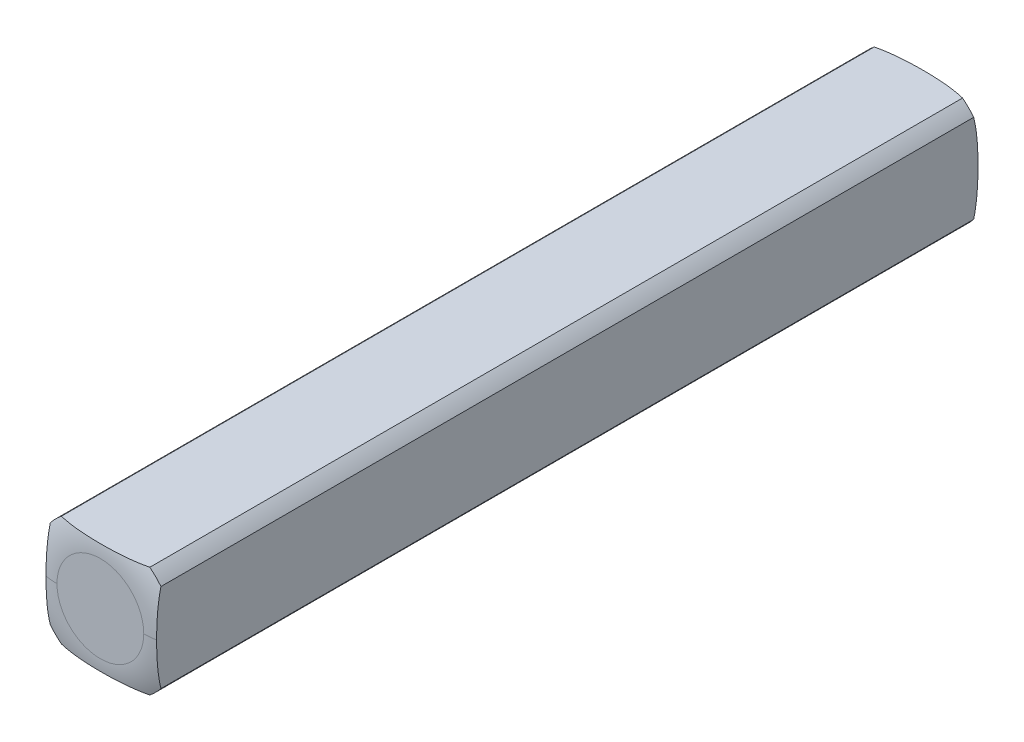
ISO-10303-21;
HEADER;
FILE_DESCRIPTION(('STEP AP214'),'2;1');
FILE_NAME('part.step','',(''),(''),'','','');
FILE_SCHEMA(('AUTOMOTIVE_DESIGN { 1 0 10303 214 1 1 1 1 }'));
ENDSEC;
DATA;
#1=APPLICATION_CONTEXT('core data for automotive mechanical design processes');
#2=APPLICATION_PROTOCOL_DEFINITION('international standard','automotive_design',2000,#1);
#3=PRODUCT_CONTEXT('',#1,'mechanical');
#4=PRODUCT('Part','Part','',(#3));
#5=PRODUCT_RELATED_PRODUCT_CATEGORY('part','',(#4));
#6=PRODUCT_DEFINITION_FORMATION('','',#4);
#7=PRODUCT_DEFINITION_CONTEXT('part definition',#1,'design');
#8=PRODUCT_DEFINITION('design','',#6,#7);
#9=PRODUCT_DEFINITION_SHAPE('','',#8);
#10=(LENGTH_UNIT() NAMED_UNIT(*) SI_UNIT(.MILLI.,.METRE.));
#11=(NAMED_UNIT(*) PLANE_ANGLE_UNIT() SI_UNIT($,.RADIAN.));
#12=(NAMED_UNIT(*) SI_UNIT($,.STERADIAN.) SOLID_ANGLE_UNIT());
#13=UNCERTAINTY_MEASURE_WITH_UNIT(LENGTH_MEASURE(1.E-05),#10,'distance_accuracy_value','');
#14=(GEOMETRIC_REPRESENTATION_CONTEXT(3) GLOBAL_UNCERTAINTY_ASSIGNED_CONTEXT((#13)) GLOBAL_UNIT_ASSIGNED_CONTEXT((#10,
#11,#12)) REPRESENTATION_CONTEXT('',''));
#15=CARTESIAN_POINT('',(0.,0.,0.));
#16=DIRECTION('',(0.,0.,1.));
#17=DIRECTION('',(1.,0.,0.));
#18=AXIS2_PLACEMENT_3D('',#15,#16,#17);
#19=CARTESIAN_POINT('',(0.,0.,-11.811));
#20=DIRECTION('',(0.,0.,1.));
#21=DIRECTION('',(1.,0.,0.));
#22=AXIS2_PLACEMENT_3D('',#19,#20,#21);
#23=CYLINDRICAL_SURFACE('',#22,2.032);
#24=CARTESIAN_POINT('',(0.,0.,-11.659919142098));
#25=DIRECTION('',(0.,0.,1.));
#26=DIRECTION('',(1.,0.,0.));
#27=AXIS2_PLACEMENT_3D('',#24,#25,#26);
#28=CIRCLE('',#27,2.032);
#29=CARTESIAN_POINT('',(-1.26841150657032,1.5875,-11.659919142098));
#30=VERTEX_POINT('',#29);
#31=CARTESIAN_POINT('',(-1.5875,1.26841150657032,-11.659919142098));
#32=VERTEX_POINT('',#31);
#33=EDGE_CURVE('E226',#30,#32,#28,.T.);
#34=ORIENTED_EDGE('',*,*,#33,.T.);
#35=DIRECTION('',(0.,0.,1.));
#36=VECTOR('',#35,1.);
#37=CARTESIAN_POINT('',(-1.5875,1.26841150657032,-11.811));
#38=LINE('',#37,#36);
#39=CARTESIAN_POINT('',(-1.5875,1.26841150657032,11.659919142098));
#40=VERTEX_POINT('',#39);
#41=EDGE_CURVE('E398',#32,#40,#38,.T.);
#42=ORIENTED_EDGE('',*,*,#41,.T.);
#43=CARTESIAN_POINT('',(0.,0.,11.659919142098));
#44=DIRECTION('',(0.,0.,-1.));
#45=DIRECTION('',(-1.,0.,0.));
#46=AXIS2_PLACEMENT_3D('',#43,#44,#45);
#47=CIRCLE('',#46,2.032);
#48=CARTESIAN_POINT('',(-1.26841150657032,1.5875,11.659919142098));
#49=VERTEX_POINT('',#48);
#50=EDGE_CURVE('E9',#40,#49,#47,.T.);
#51=ORIENTED_EDGE('',*,*,#50,.T.);
#52=DIRECTION('',(0.,0.,-1.));
#53=VECTOR('',#52,1.);
#54=CARTESIAN_POINT('',(-1.26841150657032,1.5875,-11.811));
#55=LINE('',#54,#53);
#56=EDGE_CURVE('E696',#49,#30,#55,.T.);
#57=ORIENTED_EDGE('',*,*,#56,.T.);
#58=EDGE_LOOP('',(#34,#42,#51,#57));
#59=FACE_BOUND('',#58,.T.);
#60=ADVANCED_FACE('F15',(#59),#23,.T.);
#61=CARTESIAN_POINT('',(0.,0.,-11.811));
#62=DIRECTION('',(0.,0.,1.));
#63=DIRECTION('',(1.,0.,0.));
#64=AXIS2_PLACEMENT_3D('',#61,#62,#63);
#65=CYLINDRICAL_SURFACE('',#64,2.032);
#66=CARTESIAN_POINT('',(0.,0.,-11.659919142098));
#67=DIRECTION('',(0.,0.,1.));
#68=DIRECTION('',(1.,0.,0.));
#69=AXIS2_PLACEMENT_3D('',#66,#67,#68);
#70=CIRCLE('',#69,2.032);
#71=CARTESIAN_POINT('',(1.5875,1.26841150657032,-11.659919142098));
#72=VERTEX_POINT('',#71);
#73=CARTESIAN_POINT('',(1.26841150657032,1.5875,-11.659919142098));
#74=VERTEX_POINT('',#73);
#75=EDGE_CURVE('E386',#72,#74,#70,.T.);
#76=ORIENTED_EDGE('',*,*,#75,.T.);
#77=DIRECTION('',(0.,0.,1.));
#78=VECTOR('',#77,1.);
#79=CARTESIAN_POINT('',(1.26841150657032,1.5875,-11.811));
#80=LINE('',#79,#78);
#81=CARTESIAN_POINT('',(1.26841150657032,1.5875,11.659919142098));
#82=VERTEX_POINT('',#81);
#83=EDGE_CURVE('E579',#74,#82,#80,.T.);
#84=ORIENTED_EDGE('',*,*,#83,.T.);
#85=CARTESIAN_POINT('',(0.,0.,11.659919142098));
#86=DIRECTION('',(0.,0.,-1.));
#87=DIRECTION('',(-1.,0.,0.));
#88=AXIS2_PLACEMENT_3D('',#85,#86,#87);
#89=CIRCLE('',#88,2.032);
#90=CARTESIAN_POINT('',(1.5875,1.26841150657032,11.659919142098));
#91=VERTEX_POINT('',#90);
#92=EDGE_CURVE('E30',#82,#91,#89,.T.);
#93=ORIENTED_EDGE('',*,*,#92,.T.);
#94=DIRECTION('',(0.,0.,-1.));
#95=VECTOR('',#94,1.);
#96=CARTESIAN_POINT('',(1.5875,1.26841150657032,-11.811));
#97=LINE('',#96,#95);
#98=EDGE_CURVE('E566',#91,#72,#97,.T.);
#99=ORIENTED_EDGE('',*,*,#98,.T.);
#100=EDGE_LOOP('',(#76,#84,#93,#99));
#101=FACE_BOUND('',#100,.T.);
#102=ADVANCED_FACE('F337',(#101),#65,.T.);
#103=CARTESIAN_POINT('',(0.,0.,-11.811));
#104=DIRECTION('',(0.,0.,1.));
#105=DIRECTION('',(1.,0.,0.));
#106=AXIS2_PLACEMENT_3D('',#103,#104,#105);
#107=CYLINDRICAL_SURFACE('',#106,2.032);
#108=CARTESIAN_POINT('',(0.,0.,-11.659919142098));
#109=DIRECTION('',(0.,0.,1.));
#110=DIRECTION('',(1.,0.,0.));
#111=AXIS2_PLACEMENT_3D('',#108,#109,#110);
#112=CIRCLE('',#111,2.032);
#113=CARTESIAN_POINT('',(1.26841150657032,-1.5875,-11.659919142098));
#114=VERTEX_POINT('',#113);
#115=CARTESIAN_POINT('',(1.5875,-1.26841150657032,-11.659919142098));
#116=VERTEX_POINT('',#115);
#117=EDGE_CURVE('E177',#114,#116,#112,.T.);
#118=ORIENTED_EDGE('',*,*,#117,.T.);
#119=DIRECTION('',(0.,0.,1.));
#120=VECTOR('',#119,1.);
#121=CARTESIAN_POINT('',(1.5875,-1.26841150657032,-11.811));
#122=LINE('',#121,#120);
#123=CARTESIAN_POINT('',(1.5875,-1.26841150657032,11.659919142098));
#124=VERTEX_POINT('',#123);
#125=EDGE_CURVE('E457',#116,#124,#122,.T.);
#126=ORIENTED_EDGE('',*,*,#125,.T.);
#127=CARTESIAN_POINT('',(0.,0.,11.659919142098));
#128=DIRECTION('',(0.,0.,-1.));
#129=DIRECTION('',(-1.,0.,0.));
#130=AXIS2_PLACEMENT_3D('',#127,#128,#129);
#131=CIRCLE('',#130,2.032);
#132=CARTESIAN_POINT('',(1.26841150657032,-1.5875,11.659919142098));
#133=VERTEX_POINT('',#132);
#134=EDGE_CURVE('E276',#124,#133,#131,.T.);
#135=ORIENTED_EDGE('',*,*,#134,.T.);
#136=DIRECTION('',(0.,0.,-1.));
#137=VECTOR('',#136,1.);
#138=CARTESIAN_POINT('',(1.26841150657032,-1.5875,-11.811));
#139=LINE('',#138,#137);
#140=EDGE_CURVE('E458',#133,#114,#139,.T.);
#141=ORIENTED_EDGE('',*,*,#140,.T.);
#142=EDGE_LOOP('',(#118,#126,#135,#141));
#143=FACE_BOUND('',#142,.T.);
#144=ADVANCED_FACE('F17',(#143),#107,.T.);
#145=CARTESIAN_POINT('',(0.,0.,-11.811));
#146=DIRECTION('',(0.,0.,1.));
#147=DIRECTION('',(1.,0.,0.));
#148=AXIS2_PLACEMENT_3D('',#145,#146,#147);
#149=CYLINDRICAL_SURFACE('',#148,2.032);
#150=CARTESIAN_POINT('',(0.,0.,-11.659919142098));
#151=DIRECTION('',(0.,0.,1.));
#152=DIRECTION('',(1.,0.,0.));
#153=AXIS2_PLACEMENT_3D('',#150,#151,#152);
#154=CIRCLE('',#153,2.032);
#155=CARTESIAN_POINT('',(-1.5875,-1.26841150657032,-11.659919142098));
#156=VERTEX_POINT('',#155);
#157=CARTESIAN_POINT('',(-1.26841150657032,-1.5875,-11.659919142098));
#158=VERTEX_POINT('',#157);
#159=EDGE_CURVE('E147',#156,#158,#154,.T.);
#160=ORIENTED_EDGE('',*,*,#159,.T.);
#161=DIRECTION('',(0.,0.,1.));
#162=VECTOR('',#161,1.);
#163=CARTESIAN_POINT('',(-1.26841150657032,-1.5875,-11.811));
#164=LINE('',#163,#162);
#165=CARTESIAN_POINT('',(-1.26841150657032,-1.5875,11.659919142098));
#166=VERTEX_POINT('',#165);
#167=EDGE_CURVE('E463',#158,#166,#164,.T.);
#168=ORIENTED_EDGE('',*,*,#167,.T.);
#169=CARTESIAN_POINT('',(0.,0.,11.659919142098));
#170=DIRECTION('',(0.,0.,-1.));
#171=DIRECTION('',(-1.,0.,0.));
#172=AXIS2_PLACEMENT_3D('',#169,#170,#171);
#173=CIRCLE('',#172,2.032);
#174=CARTESIAN_POINT('',(-1.5875,-1.26841150657032,11.659919142098));
#175=VERTEX_POINT('',#174);
#176=EDGE_CURVE('E506',#166,#175,#173,.T.);
#177=ORIENTED_EDGE('',*,*,#176,.T.);
#178=DIRECTION('',(0.,0.,-1.));
#179=VECTOR('',#178,1.);
#180=CARTESIAN_POINT('',(-1.5875,-1.26841150657032,-11.811));
#181=LINE('',#180,#179);
#182=EDGE_CURVE('E365',#175,#156,#181,.T.);
#183=ORIENTED_EDGE('',*,*,#182,.T.);
#184=EDGE_LOOP('',(#160,#168,#177,#183));
#185=FACE_BOUND('',#184,.T.);
#186=ADVANCED_FACE('F309',(#185),#149,.T.);
#187=CARTESIAN_POINT('',(-1.5875,1.5875,11.811));
#188=DIRECTION('',(0.,0.,-1.));
#189=DIRECTION('',(0.,-1.,0.));
#190=AXIS2_PLACEMENT_3D('',#187,#188,#189);
#191=PLANE('',#190);
#192=CARTESIAN_POINT('',(0.,0.,11.811));
#193=DIRECTION('',(0.,0.,1.));
#194=DIRECTION('',(1.,0.,0.));
#195=AXIS2_PLACEMENT_3D('',#192,#193,#194);
#196=CIRCLE('',#195,1.24506403026729);
#197=CARTESIAN_POINT('',(1.24506403026729,0.,11.811));
#198=VERTEX_POINT('',#197);
#199=CARTESIAN_POINT('',(-1.24506403026729,0.,11.811));
#200=VERTEX_POINT('',#199);
#201=EDGE_CURVE('E139',#198,#200,#196,.T.);
#202=ORIENTED_EDGE('',*,*,#201,.T.);
#203=CARTESIAN_POINT('',(0.,0.,11.811));
#204=DIRECTION('',(0.,0.,1.));
#205=DIRECTION('',(1.,0.,0.));
#206=AXIS2_PLACEMENT_3D('',#203,#204,#205);
#207=CIRCLE('',#206,1.24506403026729);
#208=EDGE_CURVE('E145',#200,#198,#207,.T.);
#209=ORIENTED_EDGE('',*,*,#208,.T.);
#210=EDGE_LOOP('',(#202,#209));
#211=FACE_BOUND('',#210,.T.);
#212=ADVANCED_FACE('F138',(#211),#191,.F.);
#213=CARTESIAN_POINT('',(-1.5875,1.5875,-11.811));
#214=DIRECTION('',(0.,0.,-1.));
#215=DIRECTION('',(0.,-1.,0.));
#216=AXIS2_PLACEMENT_3D('',#213,#214,#215);
#217=PLANE('',#216);
#218=CARTESIAN_POINT('',(0.,0.,-11.811));
#219=DIRECTION('',(0.,0.,1.));
#220=DIRECTION('',(1.,0.,0.));
#221=AXIS2_PLACEMENT_3D('',#218,#219,#220);
#222=CIRCLE('',#221,1.24506403026729);
#223=CARTESIAN_POINT('',(1.24506403026729,0.,-11.811));
#224=VERTEX_POINT('',#223);
#225=CARTESIAN_POINT('',(-1.24506403026729,0.,-11.811));
#226=VERTEX_POINT('',#225);
#227=EDGE_CURVE('E167',#224,#226,#222,.T.);
#228=ORIENTED_EDGE('',*,*,#227,.F.);
#229=CARTESIAN_POINT('',(0.,0.,-11.811));
#230=DIRECTION('',(0.,0.,1.));
#231=DIRECTION('',(1.,0.,0.));
#232=AXIS2_PLACEMENT_3D('',#229,#230,#231);
#233=CIRCLE('',#232,1.24506403026729);
#234=EDGE_CURVE('E173',#226,#224,#233,.T.);
#235=ORIENTED_EDGE('',*,*,#234,.F.);
#236=EDGE_LOOP('',(#228,#235));
#237=FACE_BOUND('',#236,.T.);
#238=ADVANCED_FACE('F613',(#237),#217,.T.);
#239=CARTESIAN_POINT('',(0.,0.,9.686));
#240=DIRECTION('',(0.,0.,-1.));
#241=DIRECTION('',(1.,0.,0.));
#242=AXIS2_PLACEMENT_3D('',#239,#240,#241);
#243=DEGENERATE_TOROIDAL_SURFACE('',#242,1.24506403026729,2.125,.T.);
#244=CARTESIAN_POINT('',(-1.24506403026729,0.,9.686));
#245=DIRECTION('',(0.,-1.,0.));
#246=DIRECTION('',(1.,0.,0.));
#247=AXIS2_PLACEMENT_3D('',#244,#245,#246);
#248=CIRCLE('',#247,2.125);
#249=CARTESIAN_POINT('',(-1.5875,0.,11.7832273616929));
#250=VERTEX_POINT('',#249);
#251=EDGE_CURVE('E146',#200,#250,#248,.T.);
#252=ORIENTED_EDGE('',*,*,#251,.F.);
#253=ORIENTED_EDGE('',*,*,#201,.F.);
#254=CARTESIAN_POINT('',(1.24506403026729,0.,9.686));
#255=DIRECTION('',(0.,1.,0.));
#256=DIRECTION('',(0.,0.,1.));
#257=AXIS2_PLACEMENT_3D('',#254,#255,#256);
#258=CIRCLE('',#257,2.125);
#259=CARTESIAN_POINT('',(1.5875,0.,11.7832273616929));
#260=VERTEX_POINT('',#259);
#261=EDGE_CURVE('E165',#198,#260,#258,.T.);
#262=ORIENTED_EDGE('',*,*,#261,.T.);
#263=CARTESIAN_POINT('',(1.5875,1.26841150657033,11.659919142098));
#264=CARTESIAN_POINT('',(1.5875,0.98707709494531,11.7299306391268));
#265=CARTESIAN_POINT('',(1.5875,0.63953045901757,11.7591819538896));
#266=CARTESIAN_POINT('',(1.5875,0.35383729755582,11.7832273616929));
#267=CARTESIAN_POINT('',(1.5875,0.,11.7832273616929));
#268=B_SPLINE_CURVE_WITH_KNOTS('',2,(#263,#264,#265,#266,#267),.UNSPECIFIED.,.F.,.F.,(3,2,3),
(0.,0.5,1.),.UNSPECIFIED.);
#269=EDGE_CURVE('E575',#91,#260,#268,.T.);
#270=ORIENTED_EDGE('',*,*,#269,.F.);
#271=ORIENTED_EDGE('',*,*,#92,.F.);
#272=CARTESIAN_POINT('',(-1.26841150657032,1.5875,11.659919142098));
#273=CARTESIAN_POINT('',(-0.770338232190248,1.5875,11.7838672057847));
#274=CARTESIAN_POINT('',(0.00849337593368006,1.5875,11.7832236517902));
#275=CARTESIAN_POINT('',(0.775470990418345,1.5875,11.7825898928334));
#276=CARTESIAN_POINT('',(1.26841150657033,1.5875,11.659919142098));
#277=B_SPLINE_CURVE_WITH_KNOTS('',2,(#272,#273,#274,#275,#276),.UNSPECIFIED.,.F.,.F.,(3,2,3),
(0.,0.5,1.),.UNSPECIFIED.);
#278=EDGE_CURVE('E180',#49,#82,#277,.T.);
#279=ORIENTED_EDGE('',*,*,#278,.F.);
#280=ORIENTED_EDGE('',*,*,#50,.F.);
#281=CARTESIAN_POINT('',(-1.5875,0.,11.7832273616929));
#282=CARTESIAN_POINT('',(-1.5875,0.353179957375675,11.7832273616929));
#283=CARTESIAN_POINT('',(-1.5875,0.6395293222865,11.7591820494506));
#284=CARTESIAN_POINT('',(-1.5875,0.986669843228865,11.7300319857842));
#285=CARTESIAN_POINT('',(-1.5875,1.26841150657033,11.659919142098));
#286=B_SPLINE_CURVE_WITH_KNOTS('',2,(#281,#282,#283,#284,#285),.UNSPECIFIED.,.F.,.F.,(3,2,3),
(0.,0.5,1.),.UNSPECIFIED.);
#287=EDGE_CURVE('E152',#250,#40,#286,.T.);
#288=ORIENTED_EDGE('',*,*,#287,.F.);
#289=EDGE_LOOP('',(#252,#253,#262,#270,#271,#279,#280,#288));
#290=FACE_BOUND('',#289,.T.);
#291=ADVANCED_FACE('F148',(#290),#243,.T.);
#292=CARTESIAN_POINT('',(0.,0.,-9.686));
#293=DIRECTION('',(0.,0.,1.));
#294=DIRECTION('',(1.,0.,0.));
#295=AXIS2_PLACEMENT_3D('',#292,#293,#294);
#296=DEGENERATE_TOROIDAL_SURFACE('',#295,1.24506403026729,2.125,.T.);
#297=CARTESIAN_POINT('',(-1.24506403026729,0.,-9.686));
#298=DIRECTION('',(0.,1.,0.));
#299=DIRECTION('',(-1.,0.,0.));
#300=AXIS2_PLACEMENT_3D('',#297,#298,#299);
#301=CIRCLE('',#300,2.125);
#302=CARTESIAN_POINT('',(-1.5875,0.,-11.7832273616929));
#303=VERTEX_POINT('',#302);
#304=EDGE_CURVE('E172',#226,#303,#301,.T.);
#305=ORIENTED_EDGE('',*,*,#304,.F.);
#306=ORIENTED_EDGE('',*,*,#234,.T.);
#307=CARTESIAN_POINT('',(1.24506403026729,0.,-9.686));
#308=DIRECTION('',(0.,-1.,0.));
#309=DIRECTION('',(0.,0.,-1.));
#310=AXIS2_PLACEMENT_3D('',#307,#308,#309);
#311=CIRCLE('',#310,2.125);
#312=CARTESIAN_POINT('',(1.5875,0.,-11.7832273616929));
#313=VERTEX_POINT('',#312);
#314=EDGE_CURVE('E387',#224,#313,#311,.T.);
#315=ORIENTED_EDGE('',*,*,#314,.T.);
#316=CARTESIAN_POINT('',(1.5875,-1.26841150657032,-11.659919142098));
#317=CARTESIAN_POINT('',(1.5875,-0.987077094941897,-11.7299306391276));
#318=CARTESIAN_POINT('',(1.5875,-0.63953045901757,-11.7591819538896));
#319=CARTESIAN_POINT('',(1.5875,-0.35383729755031,-11.7832273616928));
#320=CARTESIAN_POINT('',(1.5875,0.,-11.7832273616928));
#321=B_SPLINE_CURVE_WITH_KNOTS('',2,(#316,#317,#318,#319,#320),.UNSPECIFIED.,.F.,.F.,(3,2,3),
(0.,0.5,1.),.UNSPECIFIED.);
#322=EDGE_CURVE('E562',#116,#313,#321,.T.);
#323=ORIENTED_EDGE('',*,*,#322,.F.);
#324=ORIENTED_EDGE('',*,*,#117,.F.);
#325=CARTESIAN_POINT('',(-1.26841150657032,-1.5875,-11.659919142098));
#326=CARTESIAN_POINT('',(-0.770338232190255,-1.5875,-11.7838672057848));
#327=CARTESIAN_POINT('',(0.00849337593367507,-1.5875,-11.7832236517902));
#328=CARTESIAN_POINT('',(0.77547099041835,-1.5875,-11.7825898928334));
#329=CARTESIAN_POINT('',(1.26841150657033,-1.5875,-11.659919142098));
#330=B_SPLINE_CURVE_WITH_KNOTS('',2,(#325,#326,#327,#328,#329),.UNSPECIFIED.,.F.,.F.,(3,2,3),
(0.,0.5,1.),.UNSPECIFIED.);
#331=EDGE_CURVE('E324',#158,#114,#330,.T.);
#332=ORIENTED_EDGE('',*,*,#331,.F.);
#333=ORIENTED_EDGE('',*,*,#159,.F.);
#334=CARTESIAN_POINT('',(-1.5875,0.,-11.7832273616928));
#335=CARTESIAN_POINT('',(-1.5875,-0.35317995737031,-11.7832273616928));
#336=CARTESIAN_POINT('',(-1.5875,-0.639529322286498,-11.7591820494506));
#337=CARTESIAN_POINT('',(-1.5875,-0.986669843225563,-11.730031985785));
#338=CARTESIAN_POINT('',(-1.5875,-1.26841150657032,-11.659919142098));
#339=B_SPLINE_CURVE_WITH_KNOTS('',2,(#334,#335,#336,#337,#338),.UNSPECIFIED.,.F.,.F.,(3,2,3),
(0.,0.5,1.),.UNSPECIFIED.);
#340=EDGE_CURVE('E366',#303,#156,#339,.T.);
#341=ORIENTED_EDGE('',*,*,#340,.F.);
#342=EDGE_LOOP('',(#305,#306,#315,#323,#324,#332,#333,#341));
#343=FACE_BOUND('',#342,.T.);
#344=ADVANCED_FACE('F196',(#343),#296,.T.);
#345=CARTESIAN_POINT('',(-1.5875,1.5875,11.811));
#346=DIRECTION('',(0.,-1.,0.));
#347=DIRECTION('',(0.,0.,-1.));
#348=AXIS2_PLACEMENT_3D('',#345,#346,#347);
#349=PLANE('',#348);
#350=ORIENTED_EDGE('',*,*,#83,.F.);
#351=CARTESIAN_POINT('',(1.26841150657033,1.5875,-11.659919142098));
#352=CARTESIAN_POINT('',(0.770338232190255,1.5875,-11.7838672057848));
#353=CARTESIAN_POINT('',(-0.00849337593367486,1.5875,-11.7832236517902));
#354=CARTESIAN_POINT('',(-0.775470990418348,1.5875,-11.7825898928334));
#355=CARTESIAN_POINT('',(-1.26841150657032,1.5875,-11.659919142098));
#356=B_SPLINE_CURVE_WITH_KNOTS('',2,(#351,#352,#353,#354,#355),.UNSPECIFIED.,.F.,.F.,(3,2,3),
(0.,0.5,1.),.UNSPECIFIED.);
#357=EDGE_CURVE('E221',#74,#30,#356,.T.);
#358=ORIENTED_EDGE('',*,*,#357,.T.);
#359=ORIENTED_EDGE('',*,*,#56,.F.);
#360=ORIENTED_EDGE('',*,*,#278,.T.);
#361=EDGE_LOOP('',(#350,#358,#359,#360));
#362=FACE_BOUND('',#361,.T.);
#363=ADVANCED_FACE('F189',(#362),#349,.F.);
#364=CARTESIAN_POINT('',(1.5875,-1.5875,11.811));
#365=DIRECTION('',(-1.,0.,0.));
#366=DIRECTION('',(0.,0.,1.));
#367=AXIS2_PLACEMENT_3D('',#364,#365,#366);
#368=PLANE('',#367);
#369=ORIENTED_EDGE('',*,*,#125,.F.);
#370=ORIENTED_EDGE('',*,*,#322,.T.);
#371=CARTESIAN_POINT('',(1.5875,0.,-11.7832273616928));
#372=CARTESIAN_POINT('',(1.5875,0.353179957370255,-11.7832273616928));
#373=CARTESIAN_POINT('',(1.5875,0.6395293222865,-11.7591820494506));
#374=CARTESIAN_POINT('',(1.5875,0.98666984322553,-11.730031985785));
#375=CARTESIAN_POINT('',(1.5875,1.26841150657033,-11.659919142098));
#376=B_SPLINE_CURVE_WITH_KNOTS('',2,(#371,#372,#373,#374,#375),.UNSPECIFIED.,.F.,.F.,(3,2,3),
(0.,0.5,1.),.UNSPECIFIED.);
#377=EDGE_CURVE('E377',#313,#72,#376,.T.);
#378=ORIENTED_EDGE('',*,*,#377,.T.);
#379=ORIENTED_EDGE('',*,*,#98,.F.);
#380=ORIENTED_EDGE('',*,*,#269,.T.);
#381=CARTESIAN_POINT('',(1.5875,0.,11.7832273616929));
#382=CARTESIAN_POINT('',(1.5875,-0.353179957348528,11.7832273616929));
#383=CARTESIAN_POINT('',(1.5875,-0.639529322286499,11.7591820494506));
#384=CARTESIAN_POINT('',(1.5875,-0.986669843212078,11.7300319857883));
#385=CARTESIAN_POINT('',(1.5875,-1.26841150657032,11.659919142098));
#386=B_SPLINE_CURVE_WITH_KNOTS('',2,(#381,#382,#383,#384,#385),.UNSPECIFIED.,.F.,.F.,(3,2,3),
(0.,0.5,1.),.UNSPECIFIED.);
#387=EDGE_CURVE('E263',#260,#124,#386,.T.);
#388=ORIENTED_EDGE('',*,*,#387,.T.);
#389=EDGE_LOOP('',(#369,#370,#378,#379,#380,#388));
#390=FACE_BOUND('',#389,.T.);
#391=ADVANCED_FACE('F199',(#390),#368,.F.);
#392=CARTESIAN_POINT('',(-1.5875,-1.5875,11.811));
#393=DIRECTION('',(0.,1.,0.));
#394=DIRECTION('',(1.,0.,0.));
#395=AXIS2_PLACEMENT_3D('',#392,#393,#394);
#396=PLANE('',#395);
#397=ORIENTED_EDGE('',*,*,#167,.F.);
#398=ORIENTED_EDGE('',*,*,#331,.T.);
#399=ORIENTED_EDGE('',*,*,#140,.F.);
#400=CARTESIAN_POINT('',(1.26841150657033,-1.5875,11.659919142098));
#401=CARTESIAN_POINT('',(0.77033823219025,-1.5875,11.7838672057847));
#402=CARTESIAN_POINT('',(-0.00849337593367984,-1.5875,11.7832236517902));
#403=CARTESIAN_POINT('',(-0.775470990418345,-1.5875,11.7825898928334));
#404=CARTESIAN_POINT('',(-1.26841150657032,-1.5875,11.659919142098));
#405=B_SPLINE_CURVE_WITH_KNOTS('',2,(#400,#401,#402,#403,#404),.UNSPECIFIED.,.F.,.F.,(3,2,3),
(0.,0.5,1.),.UNSPECIFIED.);
#406=EDGE_CURVE('E286',#133,#166,#405,.T.);
#407=ORIENTED_EDGE('',*,*,#406,.T.);
#408=EDGE_LOOP('',(#397,#398,#399,#407));
#409=FACE_BOUND('',#408,.T.);
#410=ADVANCED_FACE('F298',(#409),#396,.F.);
#411=CARTESIAN_POINT('',(-1.5875,-1.5875,11.811));
#412=DIRECTION('',(1.,0.,0.));
#413=DIRECTION('',(0.,1.,0.));
#414=AXIS2_PLACEMENT_3D('',#411,#412,#413);
#415=PLANE('',#414);
#416=ORIENTED_EDGE('',*,*,#41,.F.);
#417=CARTESIAN_POINT('',(-1.5875,1.26841150657033,-11.659919142098));
#418=CARTESIAN_POINT('',(-1.5875,0.987077094941915,-11.7299306391276));
#419=CARTESIAN_POINT('',(-1.5875,0.63953045901757,-11.7591819538896));
#420=CARTESIAN_POINT('',(-1.5875,0.35383729755034,-11.7832273616928));
#421=CARTESIAN_POINT('',(-1.5875,0.,-11.7832273616928));
#422=B_SPLINE_CURVE_WITH_KNOTS('',2,(#417,#418,#419,#420,#421),.UNSPECIFIED.,.F.,.F.,(3,2,3),
(0.,0.5,1.),.UNSPECIFIED.);
#423=EDGE_CURVE('E362',#32,#303,#422,.T.);
#424=ORIENTED_EDGE('',*,*,#423,.T.);
#425=ORIENTED_EDGE('',*,*,#340,.T.);
#426=ORIENTED_EDGE('',*,*,#182,.F.);
#427=CARTESIAN_POINT('',(-1.5875,-1.26841150657032,11.659919142098));
#428=CARTESIAN_POINT('',(-1.5875,-0.987077094945293,11.7299306391268));
#429=CARTESIAN_POINT('',(-1.5875,-0.63953045901757,11.7591819538896));
#430=CARTESIAN_POINT('',(-1.5875,-0.353837297555794,11.7832273616929));
#431=CARTESIAN_POINT('',(-1.5875,0.,11.7832273616929));
#432=B_SPLINE_CURVE_WITH_KNOTS('',2,(#427,#428,#429,#430,#431),.UNSPECIFIED.,.F.,.F.,(3,2,3),
(0.,0.5,1.),.UNSPECIFIED.);
#433=EDGE_CURVE('E156',#175,#250,#432,.T.);
#434=ORIENTED_EDGE('',*,*,#433,.T.);
#435=ORIENTED_EDGE('',*,*,#287,.T.);
#436=EDGE_LOOP('',(#416,#424,#425,#426,#434,#435));
#437=FACE_BOUND('',#436,.T.);
#438=ADVANCED_FACE('F240',(#437),#415,.F.);
#439=CARTESIAN_POINT('',(0.,0.,-9.686));
#440=DIRECTION('',(0.,0.,1.));
#441=DIRECTION('',(1.,0.,0.));
#442=AXIS2_PLACEMENT_3D('',#439,#440,#441);
#443=DEGENERATE_TOROIDAL_SURFACE('',#442,1.24506403026729,2.125,.T.);
#444=ORIENTED_EDGE('',*,*,#227,.T.);
#445=ORIENTED_EDGE('',*,*,#304,.T.);
#446=ORIENTED_EDGE('',*,*,#423,.F.);
#447=ORIENTED_EDGE('',*,*,#33,.F.);
#448=ORIENTED_EDGE('',*,*,#357,.F.);
#449=ORIENTED_EDGE('',*,*,#75,.F.);
#450=ORIENTED_EDGE('',*,*,#377,.F.);
#451=ORIENTED_EDGE('',*,*,#314,.F.);
#452=EDGE_LOOP('',(#444,#445,#446,#447,#448,#449,#450,#451));
#453=FACE_BOUND('',#452,.T.);
#454=ADVANCED_FACE('F228',(#453),#443,.T.);
#455=CARTESIAN_POINT('',(0.,0.,9.686));
#456=DIRECTION('',(0.,0.,-1.));
#457=DIRECTION('',(1.,0.,0.));
#458=AXIS2_PLACEMENT_3D('',#455,#456,#457);
#459=DEGENERATE_TOROIDAL_SURFACE('',#458,1.24506403026729,2.125,.T.);
#460=ORIENTED_EDGE('',*,*,#208,.F.);
#461=ORIENTED_EDGE('',*,*,#251,.T.);
#462=ORIENTED_EDGE('',*,*,#433,.F.);
#463=ORIENTED_EDGE('',*,*,#176,.F.);
#464=ORIENTED_EDGE('',*,*,#406,.F.);
#465=ORIENTED_EDGE('',*,*,#134,.F.);
#466=ORIENTED_EDGE('',*,*,#387,.F.);
#467=ORIENTED_EDGE('',*,*,#261,.F.);
#468=EDGE_LOOP('',(#460,#461,#462,#463,#464,#465,#466,#467));
#469=FACE_BOUND('',#468,.T.);
#470=ADVANCED_FACE('F157',(#469),#459,.T.);
#471=CLOSED_SHELL('',(#60,#102,#144,#186,#212,#238,#291,#344,#363,#391,#410,#438,#454,#470));
#472=MANIFOLD_SOLID_BREP('B1',#471);
#473=ADVANCED_BREP_SHAPE_REPRESENTATION('',(#18,#472),#14);
#474=SHAPE_DEFINITION_REPRESENTATION(#9,#473);
ENDSEC;
END-ISO-10303-21;
